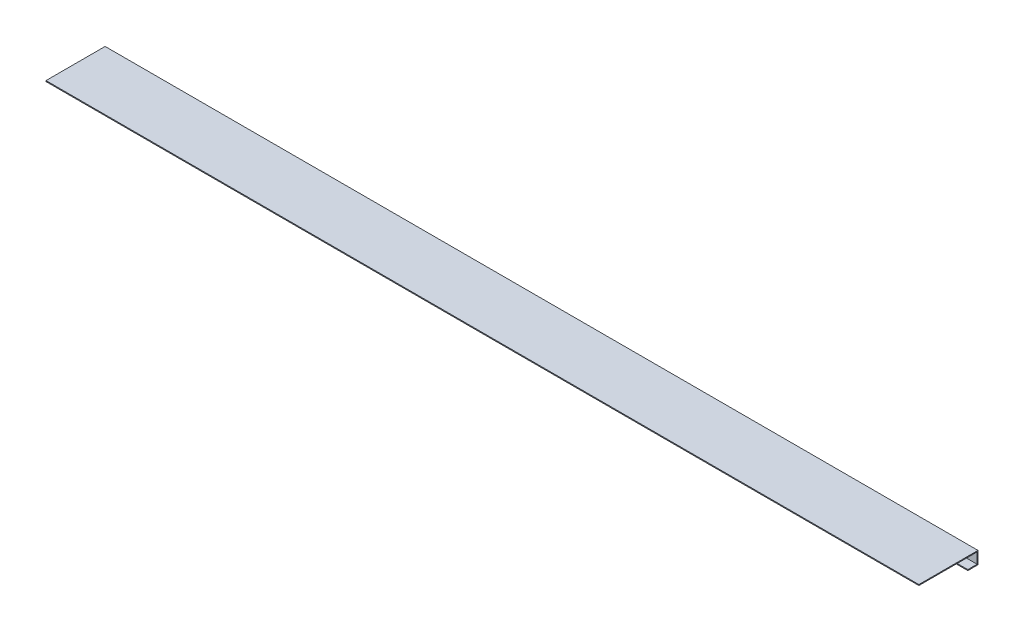
ISO-10303-21;
HEADER;
FILE_DESCRIPTION(('STEP AP214'),'2;1');
FILE_NAME('part.step','',(''),(''),'','','');
FILE_SCHEMA(('AUTOMOTIVE_DESIGN { 1 0 10303 214 1 1 1 1 }'));
ENDSEC;
DATA;
#1=APPLICATION_CONTEXT('core data for automotive mechanical design processes');
#2=APPLICATION_PROTOCOL_DEFINITION('international standard','automotive_design',2000,#1);
#3=PRODUCT_CONTEXT('',#1,'mechanical');
#4=PRODUCT('Part','Part','',(#3));
#5=PRODUCT_RELATED_PRODUCT_CATEGORY('part','',(#4));
#6=PRODUCT_DEFINITION_FORMATION('','',#4);
#7=PRODUCT_DEFINITION_CONTEXT('part definition',#1,'design');
#8=PRODUCT_DEFINITION('design','',#6,#7);
#9=PRODUCT_DEFINITION_SHAPE('','',#8);
#10=(LENGTH_UNIT() NAMED_UNIT(*) SI_UNIT(.MILLI.,.METRE.));
#11=(NAMED_UNIT(*) PLANE_ANGLE_UNIT() SI_UNIT($,.RADIAN.));
#12=(NAMED_UNIT(*) SI_UNIT($,.STERADIAN.) SOLID_ANGLE_UNIT());
#13=UNCERTAINTY_MEASURE_WITH_UNIT(LENGTH_MEASURE(1.E-05),#10,'distance_accuracy_value','');
#14=(GEOMETRIC_REPRESENTATION_CONTEXT(3) GLOBAL_UNCERTAINTY_ASSIGNED_CONTEXT((#13)) GLOBAL_UNIT_ASSIGNED_CONTEXT((#10,
#11,#12)) REPRESENTATION_CONTEXT('',''));
#15=CARTESIAN_POINT('',(0.,0.,0.));
#16=DIRECTION('',(0.,0.,1.));
#17=DIRECTION('',(1.,0.,0.));
#18=AXIS2_PLACEMENT_3D('',#15,#16,#17);
#19=CARTESIAN_POINT('',(1890.,0.,0.));
#20=DIRECTION('',(0.,0.,-1.));
#21=DIRECTION('',(-1.,0.,0.));
#22=AXIS2_PLACEMENT_3D('',#19,#20,#21);
#23=PLANE('',#22);
#24=DIRECTION('',(0.,-1.,0.));
#25=VECTOR('',#24,1.);
#26=CARTESIAN_POINT('',(0.,0.,0.));
#27=LINE('',#26,#25);
#28=CARTESIAN_POINT('',(0.,0.,0.));
#29=VERTEX_POINT('',#28);
#30=CARTESIAN_POINT('',(0.,-2.,0.));
#31=VERTEX_POINT('',#30);
#32=EDGE_CURVE('E129',#29,#31,#27,.T.);
#33=ORIENTED_EDGE('',*,*,#32,.T.);
#34=DIRECTION('',(-1.,0.,0.));
#35=VECTOR('',#34,1.);
#36=CARTESIAN_POINT('',(1890.,-2.,0.));
#37=LINE('',#36,#35);
#38=CARTESIAN_POINT('',(1890.,-2.,0.));
#39=VERTEX_POINT('',#38);
#40=EDGE_CURVE('E11',#39,#31,#37,.T.);
#41=ORIENTED_EDGE('',*,*,#40,.F.);
#42=DIRECTION('',(0.,-1.,0.));
#43=VECTOR('',#42,1.);
#44=CARTESIAN_POINT('',(1890.,0.,0.));
#45=LINE('',#44,#43);
#46=CARTESIAN_POINT('',(1890.,0.,0.));
#47=VERTEX_POINT('',#46);
#48=EDGE_CURVE('E143',#47,#39,#45,.T.);
#49=ORIENTED_EDGE('',*,*,#48,.F.);
#50=DIRECTION('',(-1.,0.,0.));
#51=VECTOR('',#50,1.);
#52=CARTESIAN_POINT('',(1890.,0.,0.));
#53=LINE('',#52,#51);
#54=EDGE_CURVE('E125',#47,#29,#53,.T.);
#55=ORIENTED_EDGE('',*,*,#54,.T.);
#56=EDGE_LOOP('',(#33,#41,#49,#55));
#57=FACE_BOUND('',#56,.T.);
#58=ADVANCED_FACE('F33',(#57),#23,.F.);
#59=CARTESIAN_POINT('',(1890.,-2.,0.));
#60=DIRECTION('',(0.,1.,0.));
#61=DIRECTION('',(0.,0.,1.));
#62=AXIS2_PLACEMENT_3D('',#59,#60,#61);
#63=PLANE('',#62);
#64=DIRECTION('',(0.,0.,-1.));
#65=VECTOR('',#64,1.);
#66=CARTESIAN_POINT('',(0.,-2.,0.));
#67=LINE('',#66,#65);
#68=CARTESIAN_POINT('',(0.,-2.,-126.));
#69=VERTEX_POINT('',#68);
#70=EDGE_CURVE('E132',#31,#69,#67,.T.);
#71=ORIENTED_EDGE('',*,*,#70,.T.);
#72=DIRECTION('',(-1.,0.,0.));
#73=VECTOR('',#72,1.);
#74=CARTESIAN_POINT('',(1890.,-2.,-126.));
#75=LINE('',#74,#73);
#76=CARTESIAN_POINT('',(1890.,-2.,-126.));
#77=VERTEX_POINT('',#76);
#78=EDGE_CURVE('E41',#77,#69,#75,.T.);
#79=ORIENTED_EDGE('',*,*,#78,.F.);
#80=DIRECTION('',(0.,0.,-1.));
#81=VECTOR('',#80,1.);
#82=CARTESIAN_POINT('',(1890.,-2.,0.));
#83=LINE('',#82,#81);
#84=EDGE_CURVE('E92',#39,#77,#83,.T.);
#85=ORIENTED_EDGE('',*,*,#84,.F.);
#86=ORIENTED_EDGE('',*,*,#40,.T.);
#87=EDGE_LOOP('',(#71,#79,#85,#86));
#88=FACE_BOUND('',#87,.T.);
#89=ADVANCED_FACE('F178',(#88),#63,.F.);
#90=CARTESIAN_POINT('',(1890.,-2.,-126.));
#91=DIRECTION('',(0.,0.,-1.));
#92=DIRECTION('',(-1.,0.,0.));
#93=AXIS2_PLACEMENT_3D('',#90,#91,#92);
#94=PLANE('',#93);
#95=DIRECTION('',(0.,-1.,0.));
#96=VECTOR('',#95,1.);
#97=CARTESIAN_POINT('',(0.,-2.,-126.));
#98=LINE('',#97,#96);
#99=CARTESIAN_POINT('',(0.,-25.,-126.));
#100=VERTEX_POINT('',#99);
#101=EDGE_CURVE('E134',#69,#100,#98,.T.);
#102=ORIENTED_EDGE('',*,*,#101,.T.);
#103=DIRECTION('',(-1.,0.,0.));
#104=VECTOR('',#103,1.);
#105=CARTESIAN_POINT('',(1890.,-25.,-126.));
#106=LINE('',#105,#104);
#107=CARTESIAN_POINT('',(1890.,-25.,-126.));
#108=VERTEX_POINT('',#107);
#109=EDGE_CURVE('E150',#108,#100,#106,.T.);
#110=ORIENTED_EDGE('',*,*,#109,.F.);
#111=DIRECTION('',(0.,-1.,0.));
#112=VECTOR('',#111,1.);
#113=CARTESIAN_POINT('',(1890.,-2.,-126.));
#114=LINE('',#113,#112);
#115=EDGE_CURVE('E158',#77,#108,#114,.T.);
#116=ORIENTED_EDGE('',*,*,#115,.F.);
#117=ORIENTED_EDGE('',*,*,#78,.T.);
#118=EDGE_LOOP('',(#102,#110,#116,#117));
#119=FACE_BOUND('',#118,.T.);
#120=ADVANCED_FACE('F156',(#119),#94,.F.);
#121=CARTESIAN_POINT('',(1890.,-25.,-126.));
#122=DIRECTION('',(0.,-1.,0.));
#123=DIRECTION('',(0.,0.,-1.));
#124=AXIS2_PLACEMENT_3D('',#121,#122,#123);
#125=PLANE('',#124);
#126=DIRECTION('',(0.,0.,1.));
#127=VECTOR('',#126,1.);
#128=CARTESIAN_POINT('',(0.,-25.,-126.));
#129=LINE('',#128,#127);
#130=CARTESIAN_POINT('',(0.,-25.,-106.));
#131=VERTEX_POINT('',#130);
#132=EDGE_CURVE('E136',#100,#131,#129,.T.);
#133=ORIENTED_EDGE('',*,*,#132,.T.);
#134=DIRECTION('',(-1.,0.,0.));
#135=VECTOR('',#134,1.);
#136=CARTESIAN_POINT('',(1890.,-25.,-106.));
#137=LINE('',#136,#135);
#138=CARTESIAN_POINT('',(1890.,-25.,-106.));
#139=VERTEX_POINT('',#138);
#140=EDGE_CURVE('E147',#139,#131,#137,.T.);
#141=ORIENTED_EDGE('',*,*,#140,.F.);
#142=DIRECTION('',(0.,0.,1.));
#143=VECTOR('',#142,1.);
#144=CARTESIAN_POINT('',(1890.,-25.,-126.));
#145=LINE('',#144,#143);
#146=EDGE_CURVE('E170',#108,#139,#145,.T.);
#147=ORIENTED_EDGE('',*,*,#146,.F.);
#148=ORIENTED_EDGE('',*,*,#109,.T.);
#149=EDGE_LOOP('',(#133,#141,#147,#148));
#150=FACE_BOUND('',#149,.T.);
#151=ADVANCED_FACE('F166',(#150),#125,.F.);
#152=CARTESIAN_POINT('',(1890.,-27.,-106.));
#153=DIRECTION('',(0.,0.,-1.));
#154=DIRECTION('',(-1.,0.,0.));
#155=AXIS2_PLACEMENT_3D('',#152,#153,#154);
#156=PLANE('',#155);
#157=DIRECTION('',(0.,-1.,0.));
#158=VECTOR('',#157,1.);
#159=CARTESIAN_POINT('',(0.,-27.,-106.));
#160=LINE('',#159,#158);
#161=CARTESIAN_POINT('',(0.,-27.,-106.));
#162=VERTEX_POINT('',#161);
#163=EDGE_CURVE('E138',#131,#162,#160,.T.);
#164=ORIENTED_EDGE('',*,*,#163,.T.);
#165=DIRECTION('',(-1.,0.,0.));
#166=VECTOR('',#165,1.);
#167=CARTESIAN_POINT('',(1890.,-27.,-106.));
#168=LINE('',#167,#166);
#169=CARTESIAN_POINT('',(1890.,-27.,-106.));
#170=VERTEX_POINT('',#169);
#171=EDGE_CURVE('E120',#170,#162,#168,.T.);
#172=ORIENTED_EDGE('',*,*,#171,.F.);
#173=DIRECTION('',(0.,-1.,0.));
#174=VECTOR('',#173,1.);
#175=CARTESIAN_POINT('',(1890.,-27.,-106.));
#176=LINE('',#175,#174);
#177=EDGE_CURVE('E111',#139,#170,#176,.T.);
#178=ORIENTED_EDGE('',*,*,#177,.F.);
#179=ORIENTED_EDGE('',*,*,#140,.T.);
#180=EDGE_LOOP('',(#164,#172,#178,#179));
#181=FACE_BOUND('',#180,.T.);
#182=ADVANCED_FACE('F169',(#181),#156,.F.);
#183=CARTESIAN_POINT('',(1890.,-27.,-128.));
#184=DIRECTION('',(0.,1.,0.));
#185=DIRECTION('',(0.,0.,1.));
#186=AXIS2_PLACEMENT_3D('',#183,#184,#185);
#187=PLANE('',#186);
#188=DIRECTION('',(0.,0.,-1.));
#189=VECTOR('',#188,1.);
#190=CARTESIAN_POINT('',(0.,-27.,-128.));
#191=LINE('',#190,#189);
#192=CARTESIAN_POINT('',(0.,-27.,-128.));
#193=VERTEX_POINT('',#192);
#194=EDGE_CURVE('E119',#162,#193,#191,.T.);
#195=ORIENTED_EDGE('',*,*,#194,.T.);
#196=DIRECTION('',(-1.,0.,0.));
#197=VECTOR('',#196,1.);
#198=CARTESIAN_POINT('',(1890.,-27.,-128.));
#199=LINE('',#198,#197);
#200=CARTESIAN_POINT('',(1890.,-27.,-128.));
#201=VERTEX_POINT('',#200);
#202=EDGE_CURVE('E116',#201,#193,#199,.T.);
#203=ORIENTED_EDGE('',*,*,#202,.F.);
#204=DIRECTION('',(0.,0.,-1.));
#205=VECTOR('',#204,1.);
#206=CARTESIAN_POINT('',(1890.,-27.,-128.));
#207=LINE('',#206,#205);
#208=EDGE_CURVE('E105',#170,#201,#207,.T.);
#209=ORIENTED_EDGE('',*,*,#208,.F.);
#210=ORIENTED_EDGE('',*,*,#171,.T.);
#211=EDGE_LOOP('',(#195,#203,#209,#210));
#212=FACE_BOUND('',#211,.T.);
#213=ADVANCED_FACE('F117',(#212),#187,.F.);
#214=CARTESIAN_POINT('',(1890.,0.,-128.));
#215=DIRECTION('',(0.,0.,1.));
#216=DIRECTION('',(1.,0.,0.));
#217=AXIS2_PLACEMENT_3D('',#214,#215,#216);
#218=PLANE('',#217);
#219=DIRECTION('',(0.,1.,0.));
#220=VECTOR('',#219,1.);
#221=CARTESIAN_POINT('',(0.,0.,-128.));
#222=LINE('',#221,#220);
#223=CARTESIAN_POINT('',(0.,0.,-128.));
#224=VERTEX_POINT('',#223);
#225=EDGE_CURVE('E78',#193,#224,#222,.T.);
#226=ORIENTED_EDGE('',*,*,#225,.T.);
#227=DIRECTION('',(-1.,0.,0.));
#228=VECTOR('',#227,1.);
#229=CARTESIAN_POINT('',(1890.,0.,-128.));
#230=LINE('',#229,#228);
#231=CARTESIAN_POINT('',(1890.,0.,-128.));
#232=VERTEX_POINT('',#231);
#233=EDGE_CURVE('E121',#232,#224,#230,.T.);
#234=ORIENTED_EDGE('',*,*,#233,.F.);
#235=DIRECTION('',(0.,1.,0.));
#236=VECTOR('',#235,1.);
#237=CARTESIAN_POINT('',(1890.,0.,-128.));
#238=LINE('',#237,#236);
#239=EDGE_CURVE('E109',#201,#232,#238,.T.);
#240=ORIENTED_EDGE('',*,*,#239,.F.);
#241=ORIENTED_EDGE('',*,*,#202,.T.);
#242=EDGE_LOOP('',(#226,#234,#240,#241));
#243=FACE_BOUND('',#242,.T.);
#244=ADVANCED_FACE('F123',(#243),#218,.F.);
#245=CARTESIAN_POINT('',(1890.,0.,0.));
#246=DIRECTION('',(0.,-1.,0.));
#247=DIRECTION('',(0.,0.,-1.));
#248=AXIS2_PLACEMENT_3D('',#245,#246,#247);
#249=PLANE('',#248);
#250=DIRECTION('',(0.,0.,1.));
#251=VECTOR('',#250,1.);
#252=CARTESIAN_POINT('',(0.,0.,0.));
#253=LINE('',#252,#251);
#254=EDGE_CURVE('E84',#224,#29,#253,.T.);
#255=ORIENTED_EDGE('',*,*,#254,.T.);
#256=ORIENTED_EDGE('',*,*,#54,.F.);
#257=DIRECTION('',(0.,0.,1.));
#258=VECTOR('',#257,1.);
#259=CARTESIAN_POINT('',(1890.,0.,0.));
#260=LINE('',#259,#258);
#261=EDGE_CURVE('E49',#232,#47,#260,.T.);
#262=ORIENTED_EDGE('',*,*,#261,.F.);
#263=ORIENTED_EDGE('',*,*,#233,.T.);
#264=EDGE_LOOP('',(#255,#256,#262,#263));
#265=FACE_BOUND('',#264,.T.);
#266=ADVANCED_FACE('F194',(#265),#249,.F.);
#267=CARTESIAN_POINT('',(1890.,0.,0.));
#268=DIRECTION('',(1.,0.,0.));
#269=DIRECTION('',(0.,0.,-1.));
#270=AXIS2_PLACEMENT_3D('',#267,#268,#269);
#271=PLANE('',#270);
#272=ORIENTED_EDGE('',*,*,#48,.T.);
#273=ORIENTED_EDGE('',*,*,#84,.T.);
#274=ORIENTED_EDGE('',*,*,#115,.T.);
#275=ORIENTED_EDGE('',*,*,#146,.T.);
#276=ORIENTED_EDGE('',*,*,#177,.T.);
#277=ORIENTED_EDGE('',*,*,#208,.T.);
#278=ORIENTED_EDGE('',*,*,#239,.T.);
#279=ORIENTED_EDGE('',*,*,#261,.T.);
#280=EDGE_LOOP('',(#272,#273,#274,#275,#276,#277,#278,#279));
#281=FACE_BOUND('',#280,.T.);
#282=ADVANCED_FACE('F107',(#281),#271,.T.);
#283=CARTESIAN_POINT('',(0.,0.,0.));
#284=DIRECTION('',(1.,0.,0.));
#285=DIRECTION('',(0.,0.,-1.));
#286=AXIS2_PLACEMENT_3D('',#283,#284,#285);
#287=PLANE('',#286);
#288=ORIENTED_EDGE('',*,*,#32,.F.);
#289=ORIENTED_EDGE('',*,*,#254,.F.);
#290=ORIENTED_EDGE('',*,*,#225,.F.);
#291=ORIENTED_EDGE('',*,*,#194,.F.);
#292=ORIENTED_EDGE('',*,*,#163,.F.);
#293=ORIENTED_EDGE('',*,*,#132,.F.);
#294=ORIENTED_EDGE('',*,*,#101,.F.);
#295=ORIENTED_EDGE('',*,*,#70,.F.);
#296=EDGE_LOOP('',(#288,#289,#290,#291,#292,#293,#294,#295));
#297=FACE_BOUND('',#296,.T.);
#298=ADVANCED_FACE('F162',(#297),#287,.F.);
#299=CLOSED_SHELL('',(#58,#89,#120,#151,#182,#213,#244,#266,#282,#298));
#300=MANIFOLD_SOLID_BREP('B2',#299);
#301=ADVANCED_BREP_SHAPE_REPRESENTATION('',(#18,#300),#14);
#302=SHAPE_DEFINITION_REPRESENTATION(#9,#301);
ENDSEC;
END-ISO-10303-21;
